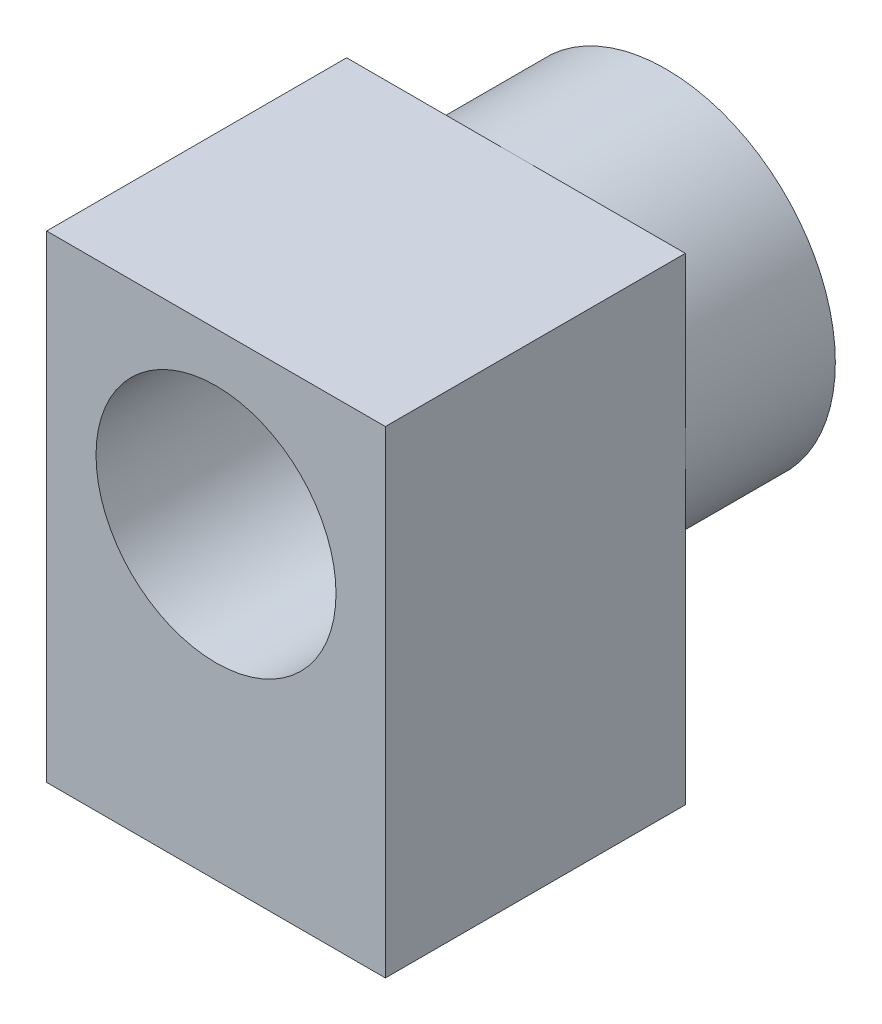
ISO-10303-21;
HEADER;
FILE_DESCRIPTION(('STEP AP214'),'2;1');
FILE_NAME('part.step','',(''),(''),'','','');
FILE_SCHEMA(('AUTOMOTIVE_DESIGN { 1 0 10303 214 1 1 1 1 }'));
ENDSEC;
DATA;
#1=APPLICATION_CONTEXT('core data for automotive mechanical design processes');
#2=APPLICATION_PROTOCOL_DEFINITION('international standard','automotive_design',2000,#1);
#3=PRODUCT_CONTEXT('',#1,'mechanical');
#4=PRODUCT('Part','Part','',(#3));
#5=PRODUCT_RELATED_PRODUCT_CATEGORY('part','',(#4));
#6=PRODUCT_DEFINITION_FORMATION('','',#4);
#7=PRODUCT_DEFINITION_CONTEXT('part definition',#1,'design');
#8=PRODUCT_DEFINITION('design','',#6,#7);
#9=PRODUCT_DEFINITION_SHAPE('','',#8);
#10=(LENGTH_UNIT() NAMED_UNIT(*) SI_UNIT(.MILLI.,.METRE.));
#11=(NAMED_UNIT(*) PLANE_ANGLE_UNIT() SI_UNIT($,.RADIAN.));
#12=(NAMED_UNIT(*) SI_UNIT($,.STERADIAN.) SOLID_ANGLE_UNIT());
#13=UNCERTAINTY_MEASURE_WITH_UNIT(LENGTH_MEASURE(1.E-05),#10,'distance_accuracy_value','');
#14=(GEOMETRIC_REPRESENTATION_CONTEXT(3) GLOBAL_UNCERTAINTY_ASSIGNED_CONTEXT((#13)) GLOBAL_UNIT_ASSIGNED_CONTEXT((#10,
#11,#12)) REPRESENTATION_CONTEXT('',''));
#15=CARTESIAN_POINT('',(0.,0.,0.));
#16=DIRECTION('',(0.,0.,1.));
#17=DIRECTION('',(1.,0.,0.));
#18=AXIS2_PLACEMENT_3D('',#15,#16,#17);
#19=CARTESIAN_POINT('',(0.,0.,0.));
#20=DIRECTION('',(0.,0.,1.));
#21=DIRECTION('',(1.,0.,0.));
#22=AXIS2_PLACEMENT_3D('',#19,#20,#21);
#23=PLANE('',#22);
#24=CARTESIAN_POINT('',(0.,0.,0.));
#25=DIRECTION('',(0.,0.,1.));
#26=DIRECTION('',(1.,0.,0.));
#27=AXIS2_PLACEMENT_3D('',#24,#25,#26);
#28=CIRCLE('',#27,11.2917300284479);
#29=CARTESIAN_POINT('',(11.2917300284479,0.,0.));
#30=VERTEX_POINT('',#29);
#31=EDGE_CURVE('E49',#30,#30,#28,.T.);
#32=ORIENTED_EDGE('',*,*,#31,.F.);
#33=EDGE_LOOP('',(#32));
#34=FACE_BOUND('',#33,.T.);
#35=CARTESIAN_POINT('',(0.,0.,0.));
#36=DIRECTION('',(0.,0.,1.));
#37=DIRECTION('',(1.,0.,0.));
#38=AXIS2_PLACEMENT_3D('',#35,#36,#37);
#39=CIRCLE('',#38,8.);
#40=CARTESIAN_POINT('',(8.,0.,0.));
#41=VERTEX_POINT('',#40);
#42=EDGE_CURVE('E119',#41,#41,#39,.T.);
#43=ORIENTED_EDGE('',*,*,#42,.T.);
#44=EDGE_LOOP('',(#43));
#45=FACE_BOUND('',#44,.T.);
#46=ADVANCED_FACE('F45',(#34,#45),#23,.F.);
#47=CARTESIAN_POINT('',(0.,0.,10.));
#48=DIRECTION('',(0.,0.,-1.));
#49=DIRECTION('',(-1.,0.,0.));
#50=AXIS2_PLACEMENT_3D('',#47,#48,#49);
#51=CYLINDRICAL_SURFACE('',#50,11.2917300284479);
#52=CARTESIAN_POINT('',(0.,0.,10.));
#53=DIRECTION('',(0.,0.,1.));
#54=DIRECTION('',(1.,0.,0.));
#55=AXIS2_PLACEMENT_3D('',#52,#53,#54);
#56=CIRCLE('',#55,11.2917300284479);
#57=CARTESIAN_POINT('',(11.2917300284479,0.,10.));
#58=VERTEX_POINT('',#57);
#59=CARTESIAN_POINT('',(0.,11.2917300284479,10.));
#60=VERTEX_POINT('',#59);
#61=EDGE_CURVE('E11',#58,#60,#56,.T.);
#62=ORIENTED_EDGE('',*,*,#61,.F.);
#63=CARTESIAN_POINT('',(-11.2917300284479,0.,10.));
#64=VERTEX_POINT('',#63);
#65=EDGE_CURVE('E55',#64,#58,#56,.T.);
#66=ORIENTED_EDGE('',*,*,#65,.F.);
#67=EDGE_CURVE('E54',#60,#64,#56,.T.);
#68=ORIENTED_EDGE('',*,*,#67,.F.);
#69=EDGE_LOOP('',(#62,#66,#68));
#70=FACE_BOUND('',#69,.T.);
#71=ORIENTED_EDGE('',*,*,#31,.T.);
#72=EDGE_LOOP('',(#71));
#73=FACE_BOUND('',#72,.T.);
#74=ADVANCED_FACE('F47',(#70,#73),#51,.T.);
#75=CARTESIAN_POINT('',(0.,0.,10.));
#76=DIRECTION('',(0.,0.,-1.));
#77=DIRECTION('',(-1.,0.,0.));
#78=AXIS2_PLACEMENT_3D('',#75,#76,#77);
#79=CYLINDRICAL_SURFACE('',#78,8.);
#80=ORIENTED_EDGE('',*,*,#42,.F.);
#81=EDGE_LOOP('',(#80));
#82=FACE_BOUND('',#81,.T.);
#83=CARTESIAN_POINT('',(0.,0.,30.));
#84=DIRECTION('',(0.,0.,1.));
#85=DIRECTION('',(1.,0.,0.));
#86=AXIS2_PLACEMENT_3D('',#83,#84,#85);
#87=CIRCLE('',#86,8.);
#88=CARTESIAN_POINT('',(8.,0.,30.));
#89=VERTEX_POINT('',#88);
#90=EDGE_CURVE('E142',#89,#89,#87,.T.);
#91=ORIENTED_EDGE('',*,*,#90,.T.);
#92=EDGE_LOOP('',(#91));
#93=FACE_BOUND('',#92,.T.);
#94=ADVANCED_FACE('F146',(#82,#93),#79,.F.);
#95=CARTESIAN_POINT('',(0.,0.,10.));
#96=DIRECTION('',(0.,0.,1.));
#97=DIRECTION('',(1.,0.,0.));
#98=AXIS2_PLACEMENT_3D('',#95,#96,#97);
#99=PLANE('',#98);
#100=DIRECTION('',(0.,1.,0.));
#101=VECTOR('',#100,1.);
#102=CARTESIAN_POINT('',(11.2917300284479,11.2917300284479,10.));
#103=LINE('',#102,#101);
#104=CARTESIAN_POINT('',(11.2917300284479,11.2917300284479,10.));
#105=VERTEX_POINT('',#104);
#106=EDGE_CURVE('E117',#58,#105,#103,.T.);
#107=ORIENTED_EDGE('',*,*,#106,.F.);
#108=ORIENTED_EDGE('',*,*,#61,.T.);
#109=DIRECTION('',(-1.,0.,0.));
#110=VECTOR('',#109,1.);
#111=CARTESIAN_POINT('',(-11.2917300284479,11.2917300284479,10.));
#112=LINE('',#111,#110);
#113=EDGE_CURVE('E135',#105,#60,#112,.T.);
#114=ORIENTED_EDGE('',*,*,#113,.F.);
#115=EDGE_LOOP('',(#107,#108,#114));
#116=FACE_BOUND('',#115,.T.);
#117=ADVANCED_FACE('F168',(#116),#99,.F.);
#118=CARTESIAN_POINT('',(-11.2917300284479,11.2917300284479,10.));
#119=VERTEX_POINT('',#118);
#120=EDGE_CURVE('E137',#60,#119,#112,.T.);
#121=ORIENTED_EDGE('',*,*,#120,.F.);
#122=ORIENTED_EDGE('',*,*,#67,.T.);
#123=DIRECTION('',(0.,-1.,0.));
#124=VECTOR('',#123,1.);
#125=CARTESIAN_POINT('',(-11.2917300284479,11.2917300284479,10.));
#126=LINE('',#125,#124);
#127=EDGE_CURVE('E131',#119,#64,#126,.T.);
#128=ORIENTED_EDGE('',*,*,#127,.F.);
#129=EDGE_LOOP('',(#121,#122,#128));
#130=FACE_BOUND('',#129,.T.);
#131=ADVANCED_FACE('F178',(#130),#99,.F.);
#132=CARTESIAN_POINT('',(-11.2917300284479,-20.5483812407778,10.));
#133=VERTEX_POINT('',#132);
#134=EDGE_CURVE('E134',#64,#133,#126,.T.);
#135=ORIENTED_EDGE('',*,*,#134,.F.);
#136=ORIENTED_EDGE('',*,*,#65,.T.);
#137=CARTESIAN_POINT('',(11.2917300284479,-20.5483812407778,10.));
#138=VERTEX_POINT('',#137);
#139=EDGE_CURVE('E138',#138,#58,#103,.T.);
#140=ORIENTED_EDGE('',*,*,#139,.F.);
#141=DIRECTION('',(1.,0.,0.));
#142=VECTOR('',#141,1.);
#143=CARTESIAN_POINT('',(-11.2917300284479,-20.5483812407778,10.));
#144=LINE('',#143,#142);
#145=EDGE_CURVE('E112',#133,#138,#144,.T.);
#146=ORIENTED_EDGE('',*,*,#145,.F.);
#147=EDGE_LOOP('',(#135,#136,#140,#146));
#148=FACE_BOUND('',#147,.T.);
#149=ADVANCED_FACE('F172',(#148),#99,.F.);
#150=CARTESIAN_POINT('',(11.2917300284479,11.2917300284479,30.));
#151=DIRECTION('',(-1.,0.,0.));
#152=DIRECTION('',(0.,-1.,0.));
#153=AXIS2_PLACEMENT_3D('',#150,#151,#152);
#154=PLANE('',#153);
#155=ORIENTED_EDGE('',*,*,#139,.T.);
#156=ORIENTED_EDGE('',*,*,#106,.T.);
#157=DIRECTION('',(0.,0.,-1.));
#158=VECTOR('',#157,1.);
#159=CARTESIAN_POINT('',(11.2917300284479,11.2917300284479,30.));
#160=LINE('',#159,#158);
#161=CARTESIAN_POINT('',(11.2917300284479,11.2917300284479,30.));
#162=VERTEX_POINT('',#161);
#163=EDGE_CURVE('E97',#162,#105,#160,.T.);
#164=ORIENTED_EDGE('',*,*,#163,.F.);
#165=DIRECTION('',(0.,1.,0.));
#166=VECTOR('',#165,1.);
#167=CARTESIAN_POINT('',(11.2917300284479,11.2917300284479,30.));
#168=LINE('',#167,#166);
#169=CARTESIAN_POINT('',(11.2917300284479,-20.5483812407778,30.));
#170=VERTEX_POINT('',#169);
#171=EDGE_CURVE('E103',#170,#162,#168,.T.);
#172=ORIENTED_EDGE('',*,*,#171,.F.);
#173=DIRECTION('',(0.,0.,-1.));
#174=VECTOR('',#173,1.);
#175=CARTESIAN_POINT('',(11.2917300284479,-20.5483812407778,30.));
#176=LINE('',#175,#174);
#177=EDGE_CURVE('E128',#170,#138,#176,.T.);
#178=ORIENTED_EDGE('',*,*,#177,.T.);
#179=EDGE_LOOP('',(#155,#156,#164,#172,#178));
#180=FACE_BOUND('',#179,.T.);
#181=ADVANCED_FACE('F115',(#180),#154,.F.);
#182=CARTESIAN_POINT('',(-11.2917300284479,11.2917300284479,30.));
#183=DIRECTION('',(0.,-1.,0.));
#184=DIRECTION('',(0.,0.,-1.));
#185=AXIS2_PLACEMENT_3D('',#182,#183,#184);
#186=PLANE('',#185);
#187=ORIENTED_EDGE('',*,*,#113,.T.);
#188=ORIENTED_EDGE('',*,*,#120,.T.);
#189=DIRECTION('',(0.,0.,-1.));
#190=VECTOR('',#189,1.);
#191=CARTESIAN_POINT('',(-11.2917300284479,11.2917300284479,30.));
#192=LINE('',#191,#190);
#193=CARTESIAN_POINT('',(-11.2917300284479,11.2917300284479,30.));
#194=VERTEX_POINT('',#193);
#195=EDGE_CURVE('E99',#194,#119,#192,.T.);
#196=ORIENTED_EDGE('',*,*,#195,.F.);
#197=DIRECTION('',(-1.,0.,0.));
#198=VECTOR('',#197,1.);
#199=CARTESIAN_POINT('',(-11.2917300284479,11.2917300284479,30.));
#200=LINE('',#199,#198);
#201=EDGE_CURVE('E92',#162,#194,#200,.T.);
#202=ORIENTED_EDGE('',*,*,#201,.F.);
#203=ORIENTED_EDGE('',*,*,#163,.T.);
#204=EDGE_LOOP('',(#187,#188,#196,#202,#203));
#205=FACE_BOUND('',#204,.T.);
#206=ADVANCED_FACE('F95',(#205),#186,.F.);
#207=CARTESIAN_POINT('',(-11.2917300284479,11.2917300284479,30.));
#208=DIRECTION('',(1.,0.,0.));
#209=DIRECTION('',(0.,0.,-1.));
#210=AXIS2_PLACEMENT_3D('',#207,#208,#209);
#211=PLANE('',#210);
#212=ORIENTED_EDGE('',*,*,#127,.T.);
#213=ORIENTED_EDGE('',*,*,#134,.T.);
#214=DIRECTION('',(0.,0.,-1.));
#215=VECTOR('',#214,1.);
#216=CARTESIAN_POINT('',(-11.2917300284479,-20.5483812407778,30.));
#217=LINE('',#216,#215);
#218=CARTESIAN_POINT('',(-11.2917300284479,-20.5483812407778,30.));
#219=VERTEX_POINT('',#218);
#220=EDGE_CURVE('E123',#219,#133,#217,.T.);
#221=ORIENTED_EDGE('',*,*,#220,.F.);
#222=DIRECTION('',(0.,-1.,0.));
#223=VECTOR('',#222,1.);
#224=CARTESIAN_POINT('',(-11.2917300284479,11.2917300284479,30.));
#225=LINE('',#224,#223);
#226=EDGE_CURVE('E102',#194,#219,#225,.T.);
#227=ORIENTED_EDGE('',*,*,#226,.F.);
#228=ORIENTED_EDGE('',*,*,#195,.T.);
#229=EDGE_LOOP('',(#212,#213,#221,#227,#228));
#230=FACE_BOUND('',#229,.T.);
#231=ADVANCED_FACE('F155',(#230),#211,.F.);
#232=CARTESIAN_POINT('',(-11.2917300284479,-20.5483812407778,30.));
#233=DIRECTION('',(0.,1.,0.));
#234=DIRECTION('',(0.,0.,1.));
#235=AXIS2_PLACEMENT_3D('',#232,#233,#234);
#236=PLANE('',#235);
#237=ORIENTED_EDGE('',*,*,#145,.T.);
#238=ORIENTED_EDGE('',*,*,#177,.F.);
#239=DIRECTION('',(1.,0.,0.));
#240=VECTOR('',#239,1.);
#241=CARTESIAN_POINT('',(-11.2917300284479,-20.5483812407778,30.));
#242=LINE('',#241,#240);
#243=EDGE_CURVE('E108',#219,#170,#242,.T.);
#244=ORIENTED_EDGE('',*,*,#243,.F.);
#245=ORIENTED_EDGE('',*,*,#220,.T.);
#246=EDGE_LOOP('',(#237,#238,#244,#245));
#247=FACE_BOUND('',#246,.T.);
#248=ADVANCED_FACE('F149',(#247),#236,.F.);
#249=CARTESIAN_POINT('',(0.,0.,30.));
#250=DIRECTION('',(0.,0.,1.));
#251=DIRECTION('',(1.,0.,0.));
#252=AXIS2_PLACEMENT_3D('',#249,#250,#251);
#253=PLANE('',#252);
#254=ORIENTED_EDGE('',*,*,#90,.F.);
#255=EDGE_LOOP('',(#254));
#256=FACE_BOUND('',#255,.T.);
#257=ORIENTED_EDGE('',*,*,#171,.T.);
#258=ORIENTED_EDGE('',*,*,#201,.T.);
#259=ORIENTED_EDGE('',*,*,#226,.T.);
#260=ORIENTED_EDGE('',*,*,#243,.T.);
#261=EDGE_LOOP('',(#257,#258,#259,#260));
#262=FACE_BOUND('',#261,.T.);
#263=ADVANCED_FACE('F106',(#256,#262),#253,.T.);
#264=CLOSED_SHELL('',(#46,#74,#94,#117,#131,#149,#181,#206,#231,#248,#263));
#265=MANIFOLD_SOLID_BREP('B2',#264);
#266=ADVANCED_BREP_SHAPE_REPRESENTATION('',(#18,#265),#14);
#267=SHAPE_DEFINITION_REPRESENTATION(#9,#266);
ENDSEC;
END-ISO-10303-21;
